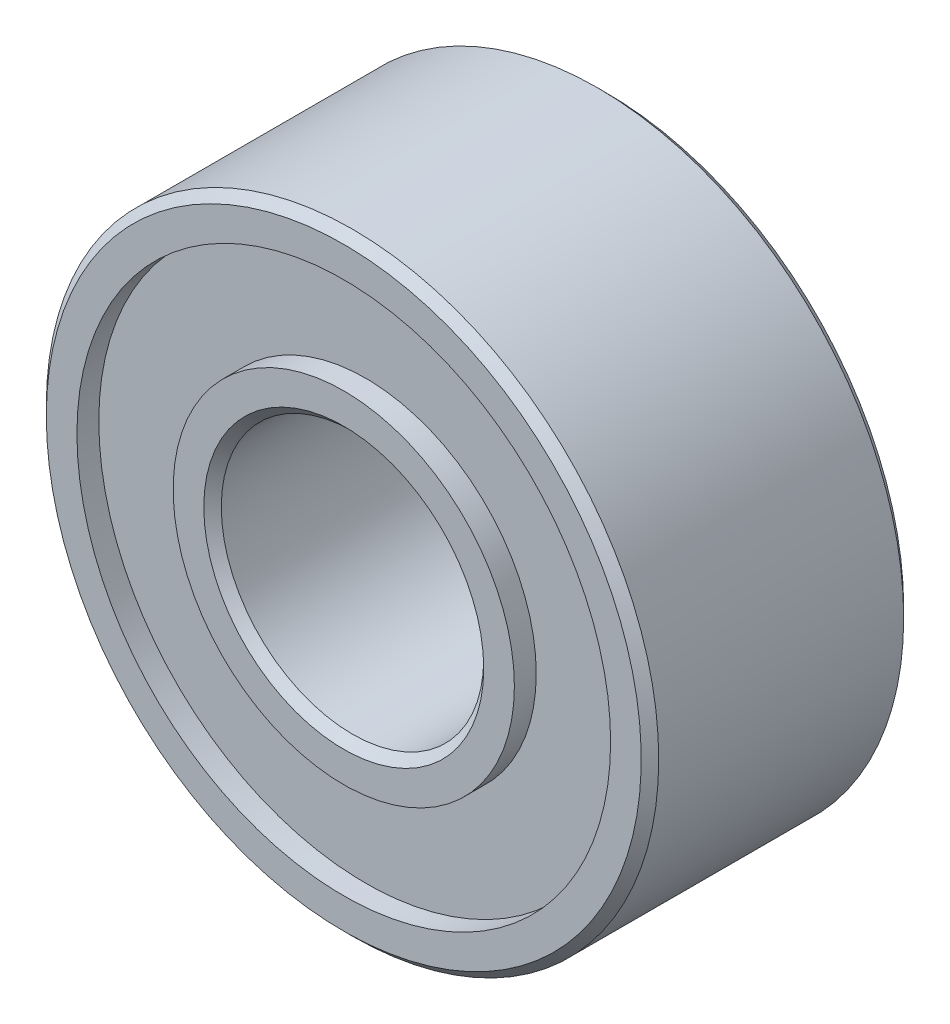
ISO-10303-21;
HEADER;
FILE_DESCRIPTION(('STEP AP214'),'2;1');
FILE_NAME('part.step','',(''),(''),'','','');
FILE_SCHEMA(('AUTOMOTIVE_DESIGN { 1 0 10303 214 1 1 1 1 }'));
ENDSEC;
DATA;
#1=APPLICATION_CONTEXT('core data for automotive mechanical design processes');
#2=APPLICATION_PROTOCOL_DEFINITION('international standard','automotive_design',2000,#1);
#3=PRODUCT_CONTEXT('',#1,'mechanical');
#4=PRODUCT('Part','Part','',(#3));
#5=PRODUCT_RELATED_PRODUCT_CATEGORY('part','',(#4));
#6=PRODUCT_DEFINITION_FORMATION('','',#4);
#7=PRODUCT_DEFINITION_CONTEXT('part definition',#1,'design');
#8=PRODUCT_DEFINITION('design','',#6,#7);
#9=PRODUCT_DEFINITION_SHAPE('','',#8);
#10=(LENGTH_UNIT() NAMED_UNIT(*) SI_UNIT(.MILLI.,.METRE.));
#11=(NAMED_UNIT(*) PLANE_ANGLE_UNIT() SI_UNIT($,.RADIAN.));
#12=(NAMED_UNIT(*) SI_UNIT($,.STERADIAN.) SOLID_ANGLE_UNIT());
#13=UNCERTAINTY_MEASURE_WITH_UNIT(LENGTH_MEASURE(1.E-05),#10,'distance_accuracy_value','');
#14=(GEOMETRIC_REPRESENTATION_CONTEXT(3) GLOBAL_UNCERTAINTY_ASSIGNED_CONTEXT((#13)) GLOBAL_UNIT_ASSIGNED_CONTEXT((#10,
#11,#12)) REPRESENTATION_CONTEXT('',''));
#15=CARTESIAN_POINT('',(0.,0.,0.));
#16=DIRECTION('',(0.,0.,1.));
#17=DIRECTION('',(1.,0.,0.));
#18=AXIS2_PLACEMENT_3D('',#15,#16,#17);
#19=CARTESIAN_POINT('',(0.,1.5,-1.5));
#20=DIRECTION('',(0.,0.,1.));
#21=DIRECTION('',(1.,0.,0.));
#22=AXIS2_PLACEMENT_3D('',#19,#20,#21);
#23=PLANE('',#22);
#24=CARTESIAN_POINT('',(0.,0.,-1.5));
#25=DIRECTION('',(0.,0.,1.));
#26=DIRECTION('',(1.,0.,0.));
#27=AXIS2_PLACEMENT_3D('',#24,#25,#26);
#28=CIRCLE('',#27,1.6);
#29=CARTESIAN_POINT('',(1.6,0.,-1.5));
#30=VERTEX_POINT('',#29);
#31=EDGE_CURVE('E64',#30,#30,#28,.T.);
#32=ORIENTED_EDGE('',*,*,#31,.T.);
#33=EDGE_LOOP('',(#32));
#34=FACE_BOUND('',#33,.T.);
#35=CARTESIAN_POINT('',(0.,0.,-1.5));
#36=DIRECTION('',(0.,0.,1.));
#37=DIRECTION('',(1.,0.,0.));
#38=AXIS2_PLACEMENT_3D('',#35,#36,#37);
#39=CIRCLE('',#38,1.95);
#40=CARTESIAN_POINT('',(1.95,0.,-1.5));
#41=VERTEX_POINT('',#40);
#42=EDGE_CURVE('E67',#41,#41,#39,.T.);
#43=ORIENTED_EDGE('',*,*,#42,.F.);
#44=EDGE_LOOP('',(#43));
#45=FACE_BOUND('',#44,.T.);
#46=ADVANCED_FACE('F35',(#34,#45),#23,.F.);
#47=CARTESIAN_POINT('',(0.,0.,11.8458465216965));
#48=DIRECTION('',(0.,0.,1.));
#49=DIRECTION('',(1.,0.,0.));
#50=AXIS2_PLACEMENT_3D('',#47,#48,#49);
#51=CYLINDRICAL_SURFACE('',#50,1.95);
#52=CARTESIAN_POINT('',(0.,0.,-1.25));
#53=DIRECTION('',(0.,0.,1.));
#54=DIRECTION('',(1.,0.,0.));
#55=AXIS2_PLACEMENT_3D('',#52,#53,#54);
#56=CIRCLE('',#55,1.95);
#57=CARTESIAN_POINT('',(1.95,0.,-1.25));
#58=VERTEX_POINT('',#57);
#59=EDGE_CURVE('E70',#58,#58,#56,.T.);
#60=ORIENTED_EDGE('',*,*,#59,.F.);
#61=EDGE_LOOP('',(#60));
#62=FACE_BOUND('',#61,.T.);
#63=ORIENTED_EDGE('',*,*,#42,.T.);
#64=EDGE_LOOP('',(#63));
#65=FACE_BOUND('',#64,.T.);
#66=ADVANCED_FACE('F123',(#62,#65),#51,.T.);
#67=CARTESIAN_POINT('',(0.,1.95,-1.25));
#68=DIRECTION('',(0.,0.,1.));
#69=DIRECTION('',(1.,0.,0.));
#70=AXIS2_PLACEMENT_3D('',#67,#68,#69);
#71=PLANE('',#70);
#72=CARTESIAN_POINT('',(0.,0.,-1.25));
#73=DIRECTION('',(0.,0.,1.));
#74=DIRECTION('',(1.,0.,0.));
#75=AXIS2_PLACEMENT_3D('',#72,#73,#74);
#76=CIRCLE('',#75,3.05);
#77=CARTESIAN_POINT('',(3.05,0.,-1.25));
#78=VERTEX_POINT('',#77);
#79=EDGE_CURVE('E73',#78,#78,#76,.T.);
#80=ORIENTED_EDGE('',*,*,#79,.F.);
#81=EDGE_LOOP('',(#80));
#82=FACE_BOUND('',#81,.T.);
#83=ORIENTED_EDGE('',*,*,#59,.T.);
#84=EDGE_LOOP('',(#83));
#85=FACE_BOUND('',#84,.T.);
#86=ADVANCED_FACE('F129',(#82,#85),#71,.F.);
#87=CARTESIAN_POINT('',(0.,0.,11.8458465216965));
#88=DIRECTION('',(0.,0.,1.));
#89=DIRECTION('',(1.,0.,0.));
#90=AXIS2_PLACEMENT_3D('',#87,#88,#89);
#91=CYLINDRICAL_SURFACE('',#90,3.05);
#92=CARTESIAN_POINT('',(0.,0.,-1.5));
#93=DIRECTION('',(0.,0.,1.));
#94=DIRECTION('',(1.,0.,0.));
#95=AXIS2_PLACEMENT_3D('',#92,#93,#94);
#96=CIRCLE('',#95,3.05);
#97=CARTESIAN_POINT('',(3.05,0.,-1.5));
#98=VERTEX_POINT('',#97);
#99=EDGE_CURVE('E76',#98,#98,#96,.T.);
#100=ORIENTED_EDGE('',*,*,#99,.F.);
#101=EDGE_LOOP('',(#100));
#102=FACE_BOUND('',#101,.T.);
#103=ORIENTED_EDGE('',*,*,#79,.T.);
#104=EDGE_LOOP('',(#103));
#105=FACE_BOUND('',#104,.T.);
#106=ADVANCED_FACE('F211',(#102,#105),#91,.F.);
#107=CARTESIAN_POINT('',(0.,3.05,-1.5));
#108=DIRECTION('',(0.,0.,1.));
#109=DIRECTION('',(1.,0.,0.));
#110=AXIS2_PLACEMENT_3D('',#107,#108,#109);
#111=PLANE('',#110);
#112=CARTESIAN_POINT('',(0.,0.,-1.5));
#113=DIRECTION('',(0.,0.,1.));
#114=DIRECTION('',(1.,0.,0.));
#115=AXIS2_PLACEMENT_3D('',#112,#113,#114);
#116=CIRCLE('',#115,3.4);
#117=CARTESIAN_POINT('',(3.4,0.,-1.5));
#118=VERTEX_POINT('',#117);
#119=EDGE_CURVE('E42',#118,#118,#116,.F.);
#120=ORIENTED_EDGE('',*,*,#119,.T.);
#121=EDGE_LOOP('',(#120));
#122=FACE_BOUND('',#121,.T.);
#123=ORIENTED_EDGE('',*,*,#99,.T.);
#124=EDGE_LOOP('',(#123));
#125=FACE_BOUND('',#124,.T.);
#126=ADVANCED_FACE('F119',(#122,#125),#111,.F.);
#127=CARTESIAN_POINT('',(0.,0.,11.8458465216965));
#128=DIRECTION('',(0.,0.,1.));
#129=DIRECTION('',(1.,0.,0.));
#130=AXIS2_PLACEMENT_3D('',#127,#128,#129);
#131=CYLINDRICAL_SURFACE('',#130,3.5);
#132=CARTESIAN_POINT('',(0.,0.,-1.4));
#133=DIRECTION('',(0.,0.,1.));
#134=DIRECTION('',(1.,0.,0.));
#135=AXIS2_PLACEMENT_3D('',#132,#133,#134);
#136=CIRCLE('',#135,3.5);
#137=CARTESIAN_POINT('',(3.5,0.,-1.4));
#138=VERTEX_POINT('',#137);
#139=EDGE_CURVE('E46',#138,#138,#136,.T.);
#140=ORIENTED_EDGE('',*,*,#139,.T.);
#141=EDGE_LOOP('',(#140));
#142=FACE_BOUND('',#141,.T.);
#143=CARTESIAN_POINT('',(0.,0.,1.39999999999999));
#144=DIRECTION('',(0.,0.,-1.));
#145=DIRECTION('',(-1.,0.,0.));
#146=AXIS2_PLACEMENT_3D('',#143,#144,#145);
#147=CIRCLE('',#146,3.5);
#148=CARTESIAN_POINT('',(-3.5,0.,1.39999999999999));
#149=VERTEX_POINT('',#148);
#150=EDGE_CURVE('E50',#149,#149,#147,.T.);
#151=ORIENTED_EDGE('',*,*,#150,.T.);
#152=EDGE_LOOP('',(#151));
#153=FACE_BOUND('',#152,.T.);
#154=ADVANCED_FACE('F114',(#142,#153),#131,.T.);
#155=CARTESIAN_POINT('',(0.,3.05,1.5));
#156=DIRECTION('',(0.,0.,-1.));
#157=DIRECTION('',(-1.,0.,0.));
#158=AXIS2_PLACEMENT_3D('',#155,#156,#157);
#159=PLANE('',#158);
#160=CARTESIAN_POINT('',(0.,0.,1.5));
#161=DIRECTION('',(0.,0.,-1.));
#162=DIRECTION('',(-1.,0.,0.));
#163=AXIS2_PLACEMENT_3D('',#160,#161,#162);
#164=CIRCLE('',#163,3.4);
#165=CARTESIAN_POINT('',(-3.4,0.,1.5));
#166=VERTEX_POINT('',#165);
#167=EDGE_CURVE('E10',#166,#166,#164,.F.);
#168=ORIENTED_EDGE('',*,*,#167,.T.);
#169=EDGE_LOOP('',(#168));
#170=FACE_BOUND('',#169,.T.);
#171=CARTESIAN_POINT('',(0.,0.,1.5));
#172=DIRECTION('',(0.,0.,1.));
#173=DIRECTION('',(1.,0.,0.));
#174=AXIS2_PLACEMENT_3D('',#171,#172,#173);
#175=CIRCLE('',#174,3.05);
#176=CARTESIAN_POINT('',(3.05,0.,1.5));
#177=VERTEX_POINT('',#176);
#178=EDGE_CURVE('E79',#177,#177,#175,.T.);
#179=ORIENTED_EDGE('',*,*,#178,.F.);
#180=EDGE_LOOP('',(#179));
#181=FACE_BOUND('',#180,.T.);
#182=ADVANCED_FACE('F109',(#170,#181),#159,.F.);
#183=CARTESIAN_POINT('',(0.,0.,11.8458465216965));
#184=DIRECTION('',(0.,0.,1.));
#185=DIRECTION('',(1.,0.,0.));
#186=AXIS2_PLACEMENT_3D('',#183,#184,#185);
#187=CYLINDRICAL_SURFACE('',#186,3.05);
#188=CARTESIAN_POINT('',(0.,0.,1.25));
#189=DIRECTION('',(0.,0.,1.));
#190=DIRECTION('',(1.,0.,0.));
#191=AXIS2_PLACEMENT_3D('',#188,#189,#190);
#192=CIRCLE('',#191,3.05);
#193=CARTESIAN_POINT('',(3.05,0.,1.25));
#194=VERTEX_POINT('',#193);
#195=EDGE_CURVE('E82',#194,#194,#192,.T.);
#196=ORIENTED_EDGE('',*,*,#195,.F.);
#197=EDGE_LOOP('',(#196));
#198=FACE_BOUND('',#197,.T.);
#199=ORIENTED_EDGE('',*,*,#178,.T.);
#200=EDGE_LOOP('',(#199));
#201=FACE_BOUND('',#200,.T.);
#202=ADVANCED_FACE('F103',(#198,#201),#187,.F.);
#203=CARTESIAN_POINT('',(0.,1.95,1.25));
#204=DIRECTION('',(0.,0.,-1.));
#205=DIRECTION('',(-1.,0.,0.));
#206=AXIS2_PLACEMENT_3D('',#203,#204,#205);
#207=PLANE('',#206);
#208=CARTESIAN_POINT('',(0.,0.,1.25));
#209=DIRECTION('',(0.,0.,1.));
#210=DIRECTION('',(1.,0.,0.));
#211=AXIS2_PLACEMENT_3D('',#208,#209,#210);
#212=CIRCLE('',#211,1.95);
#213=CARTESIAN_POINT('',(1.95,0.,1.25));
#214=VERTEX_POINT('',#213);
#215=EDGE_CURVE('E85',#214,#214,#212,.T.);
#216=ORIENTED_EDGE('',*,*,#215,.F.);
#217=EDGE_LOOP('',(#216));
#218=FACE_BOUND('',#217,.T.);
#219=ORIENTED_EDGE('',*,*,#195,.T.);
#220=EDGE_LOOP('',(#219));
#221=FACE_BOUND('',#220,.T.);
#222=ADVANCED_FACE('F97',(#218,#221),#207,.F.);
#223=CARTESIAN_POINT('',(0.,0.,11.8458465216965));
#224=DIRECTION('',(0.,0.,1.));
#225=DIRECTION('',(1.,0.,0.));
#226=AXIS2_PLACEMENT_3D('',#223,#224,#225);
#227=CYLINDRICAL_SURFACE('',#226,1.95);
#228=CARTESIAN_POINT('',(0.,0.,1.5));
#229=DIRECTION('',(0.,0.,1.));
#230=DIRECTION('',(1.,0.,0.));
#231=AXIS2_PLACEMENT_3D('',#228,#229,#230);
#232=CIRCLE('',#231,1.95);
#233=CARTESIAN_POINT('',(1.95,0.,1.5));
#234=VERTEX_POINT('',#233);
#235=EDGE_CURVE('E88',#234,#234,#232,.T.);
#236=ORIENTED_EDGE('',*,*,#235,.F.);
#237=EDGE_LOOP('',(#236));
#238=FACE_BOUND('',#237,.T.);
#239=ORIENTED_EDGE('',*,*,#215,.T.);
#240=EDGE_LOOP('',(#239));
#241=FACE_BOUND('',#240,.T.);
#242=ADVANCED_FACE('F94',(#238,#241),#227,.T.);
#243=CARTESIAN_POINT('',(0.,1.5,1.5));
#244=DIRECTION('',(0.,0.,-1.));
#245=DIRECTION('',(-1.,0.,0.));
#246=AXIS2_PLACEMENT_3D('',#243,#244,#245);
#247=PLANE('',#246);
#248=CARTESIAN_POINT('',(0.,0.,1.5));
#249=DIRECTION('',(0.,0.,-1.));
#250=DIRECTION('',(-1.,0.,0.));
#251=AXIS2_PLACEMENT_3D('',#248,#249,#250);
#252=CIRCLE('',#251,1.6);
#253=CARTESIAN_POINT('',(-1.6,0.,1.5));
#254=VERTEX_POINT('',#253);
#255=EDGE_CURVE('E55',#254,#254,#252,.T.);
#256=ORIENTED_EDGE('',*,*,#255,.T.);
#257=EDGE_LOOP('',(#256));
#258=FACE_BOUND('',#257,.T.);
#259=ORIENTED_EDGE('',*,*,#235,.T.);
#260=EDGE_LOOP('',(#259));
#261=FACE_BOUND('',#260,.T.);
#262=ADVANCED_FACE('F92',(#258,#261),#247,.F.);
#263=CARTESIAN_POINT('',(0.,0.,11.8458465216965));
#264=DIRECTION('',(0.,0.,1.));
#265=DIRECTION('',(1.,0.,0.));
#266=AXIS2_PLACEMENT_3D('',#263,#264,#265);
#267=CYLINDRICAL_SURFACE('',#266,1.5);
#268=CARTESIAN_POINT('',(0.,0.,-1.4));
#269=DIRECTION('',(0.,0.,1.));
#270=DIRECTION('',(1.,0.,0.));
#271=AXIS2_PLACEMENT_3D('',#268,#269,#270);
#272=CIRCLE('',#271,1.5);
#273=CARTESIAN_POINT('',(1.5,0.,-1.4));
#274=VERTEX_POINT('',#273);
#275=EDGE_CURVE('E58',#274,#274,#272,.F.);
#276=ORIENTED_EDGE('',*,*,#275,.T.);
#277=EDGE_LOOP('',(#276));
#278=FACE_BOUND('',#277,.T.);
#279=CARTESIAN_POINT('',(0.,0.,1.4));
#280=DIRECTION('',(0.,0.,-1.));
#281=DIRECTION('',(-1.,0.,0.));
#282=AXIS2_PLACEMENT_3D('',#279,#280,#281);
#283=CIRCLE('',#282,1.5);
#284=CARTESIAN_POINT('',(-1.5,0.,1.4));
#285=VERTEX_POINT('',#284);
#286=EDGE_CURVE('E61',#285,#285,#283,.F.);
#287=ORIENTED_EDGE('',*,*,#286,.T.);
#288=EDGE_LOOP('',(#287));
#289=FACE_BOUND('',#288,.T.);
#290=ADVANCED_FACE('F139',(#278,#289),#267,.F.);
#291=CARTESIAN_POINT('',(0.,0.,-1.5));
#292=DIRECTION('',(0.,0.,-1.));
#293=DIRECTION('',(-1.,0.,0.));
#294=AXIS2_PLACEMENT_3D('',#291,#292,#293);
#295=CONICAL_SURFACE('',#294,1.6,0.785398163397438);
#296=ORIENTED_EDGE('',*,*,#275,.F.);
#297=EDGE_LOOP('',(#296));
#298=FACE_BOUND('',#297,.T.);
#299=ORIENTED_EDGE('',*,*,#31,.F.);
#300=EDGE_LOOP('',(#299));
#301=FACE_BOUND('',#300,.T.);
#302=ADVANCED_FACE('F135',(#298,#301),#295,.F.);
#303=CARTESIAN_POINT('',(0.,0.,1.4));
#304=DIRECTION('',(0.,0.,1.));
#305=DIRECTION('',(1.,0.,0.));
#306=AXIS2_PLACEMENT_3D('',#303,#304,#305);
#307=CONICAL_SURFACE('',#306,1.5,0.785398163397446);
#308=ORIENTED_EDGE('',*,*,#255,.F.);
#309=EDGE_LOOP('',(#308));
#310=FACE_BOUND('',#309,.T.);
#311=ORIENTED_EDGE('',*,*,#286,.F.);
#312=EDGE_LOOP('',(#311));
#313=FACE_BOUND('',#312,.T.);
#314=ADVANCED_FACE('F138',(#310,#313),#307,.F.);
#315=CARTESIAN_POINT('',(0.,0.,-1.4));
#316=DIRECTION('',(0.,0.,1.));
#317=DIRECTION('',(1.,0.,0.));
#318=AXIS2_PLACEMENT_3D('',#315,#316,#317);
#319=CONICAL_SURFACE('',#318,3.5,0.785398163397448);
#320=ORIENTED_EDGE('',*,*,#119,.F.);
#321=EDGE_LOOP('',(#320));
#322=FACE_BOUND('',#321,.T.);
#323=ORIENTED_EDGE('',*,*,#139,.F.);
#324=EDGE_LOOP('',(#323));
#325=FACE_BOUND('',#324,.T.);
#326=ADVANCED_FACE('F142',(#322,#325),#319,.T.);
#327=CARTESIAN_POINT('',(0.,0.,1.5));
#328=DIRECTION('',(0.,0.,-1.));
#329=DIRECTION('',(-1.,0.,0.));
#330=AXIS2_PLACEMENT_3D('',#327,#328,#329);
#331=CONICAL_SURFACE('',#330,3.4,0.785398163397446);
#332=ORIENTED_EDGE('',*,*,#150,.F.);
#333=EDGE_LOOP('',(#332));
#334=FACE_BOUND('',#333,.T.);
#335=ORIENTED_EDGE('',*,*,#167,.F.);
#336=EDGE_LOOP('',(#335));
#337=FACE_BOUND('',#336,.T.);
#338=ADVANCED_FACE('F37',(#334,#337),#331,.T.);
#339=CLOSED_SHELL('',(#46,#66,#86,#106,#126,#154,#182,#202,#222,#242,#262,#290,#302,#314,#326,#338));
#340=MANIFOLD_SOLID_BREP('B2',#339);
#341=ADVANCED_BREP_SHAPE_REPRESENTATION('',(#18,#340),#14);
#342=SHAPE_DEFINITION_REPRESENTATION(#9,#341);
ENDSEC;
END-ISO-10303-21;
